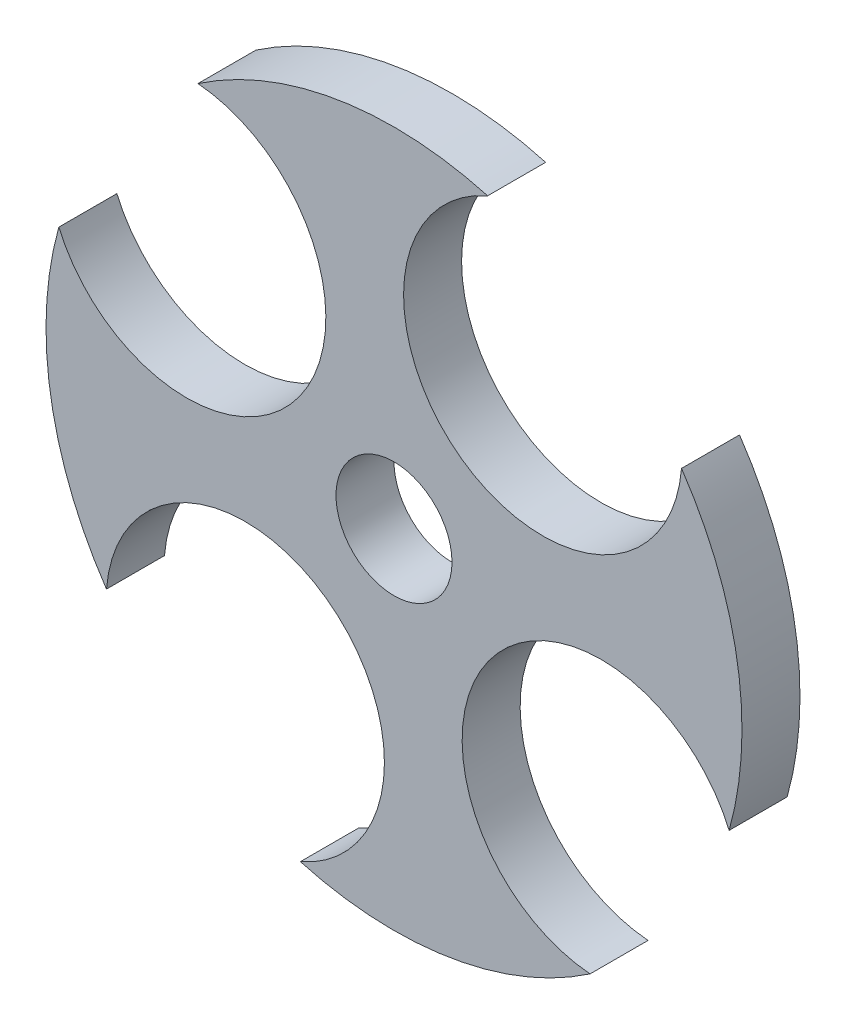
ISO-10303-21;
HEADER;
FILE_DESCRIPTION(('STEP AP214'),'2;1');
FILE_NAME('part.step','',(''),(''),'','','');
FILE_SCHEMA(('AUTOMOTIVE_DESIGN { 1 0 10303 214 1 1 1 1 }'));
ENDSEC;
DATA;
#1=APPLICATION_CONTEXT('core data for automotive mechanical design processes');
#2=APPLICATION_PROTOCOL_DEFINITION('international standard','automotive_design',2000,#1);
#3=PRODUCT_CONTEXT('',#1,'mechanical');
#4=PRODUCT('Part','Part','',(#3));
#5=PRODUCT_RELATED_PRODUCT_CATEGORY('part','',(#4));
#6=PRODUCT_DEFINITION_FORMATION('','',#4);
#7=PRODUCT_DEFINITION_CONTEXT('part definition',#1,'design');
#8=PRODUCT_DEFINITION('design','',#6,#7);
#9=PRODUCT_DEFINITION_SHAPE('','',#8);
#10=(LENGTH_UNIT() NAMED_UNIT(*) SI_UNIT(.MILLI.,.METRE.));
#11=(NAMED_UNIT(*) PLANE_ANGLE_UNIT() SI_UNIT($,.RADIAN.));
#12=(NAMED_UNIT(*) SI_UNIT($,.STERADIAN.) SOLID_ANGLE_UNIT());
#13=UNCERTAINTY_MEASURE_WITH_UNIT(LENGTH_MEASURE(1.E-05),#10,'distance_accuracy_value','');
#14=(GEOMETRIC_REPRESENTATION_CONTEXT(3) GLOBAL_UNCERTAINTY_ASSIGNED_CONTEXT((#13)) GLOBAL_UNIT_ASSIGNED_CONTEXT((#10,
#11,#12)) REPRESENTATION_CONTEXT('',''));
#15=CARTESIAN_POINT('',(0.,0.,0.));
#16=DIRECTION('',(0.,0.,1.));
#17=DIRECTION('',(1.,0.,0.));
#18=AXIS2_PLACEMENT_3D('',#15,#16,#17);
#19=CARTESIAN_POINT('',(-4.0723235353591,-5.67506881221368,3.175));
#20=DIRECTION('',(0.,0.,1.));
#21=DIRECTION('',(1.,0.,0.));
#22=AXIS2_PLACEMENT_3D('',#19,#20,#21);
#23=PLANE('',#22);
#24=CARTESIAN_POINT('',(-8.14464707071819,-11.3501376244274,3.175));
#25=DIRECTION('',(0.,0.,-1.));
#26=DIRECTION('',(1.,0.,0.));
#27=AXIS2_PLACEMENT_3D('',#24,#25,#26);
#28=CIRCLE('',#27,7.62);
#29=CARTESIAN_POINT('',(-15.7395127148097,-10.7317398170261,3.175));
#30=VERTEX_POINT('',#29);
#31=CARTESIAN_POINT('',(-5.12693845810469,-18.3471251711762,3.175));
#32=VERTEX_POINT('',#31);
#33=EDGE_CURVE('E164',#30,#32,#28,.T.);
#34=ORIENTED_EDGE('',*,*,#33,.T.);
#35=CARTESIAN_POINT('',(0.,0.,3.175));
#36=DIRECTION('',(0.,0.,1.));
#37=DIRECTION('',(1.,0.,0.));
#38=AXIS2_PLACEMENT_3D('',#35,#36,#37);
#39=CIRCLE('',#38,19.05);
#40=CARTESIAN_POINT('',(10.7317398170262,-15.7395127148097,3.175));
#41=VERTEX_POINT('',#40);
#42=EDGE_CURVE('E100',#32,#41,#39,.T.);
#43=ORIENTED_EDGE('',*,*,#42,.T.);
#44=CARTESIAN_POINT('',(11.3501376244274,-8.14464707071816,3.175));
#45=DIRECTION('',(0.,0.,-1.));
#46=DIRECTION('',(1.,0.,0.));
#47=AXIS2_PLACEMENT_3D('',#44,#45,#46);
#48=CIRCLE('',#47,7.62);
#49=CARTESIAN_POINT('',(18.3471251711762,-5.12693845810463,3.175));
#50=VERTEX_POINT('',#49);
#51=EDGE_CURVE('E185',#41,#50,#48,.T.);
#52=ORIENTED_EDGE('',*,*,#51,.T.);
#53=CARTESIAN_POINT('',(0.,0.,3.175));
#54=DIRECTION('',(0.,0.,1.));
#55=DIRECTION('',(1.,0.,0.));
#56=AXIS2_PLACEMENT_3D('',#53,#54,#55);
#57=CIRCLE('',#56,19.05);
#58=CARTESIAN_POINT('',(15.7395127148097,10.7317398170261,3.175));
#59=VERTEX_POINT('',#58);
#60=EDGE_CURVE('E199',#50,#59,#57,.T.);
#61=ORIENTED_EDGE('',*,*,#60,.T.);
#62=CARTESIAN_POINT('',(8.14464707071819,11.3501376244274,3.175));
#63=DIRECTION('',(0.,0.,-1.));
#64=DIRECTION('',(1.,0.,0.));
#65=AXIS2_PLACEMENT_3D('',#62,#63,#64);
#66=CIRCLE('',#65,7.62);
#67=CARTESIAN_POINT('',(5.12693845810469,18.3471251711762,3.175));
#68=VERTEX_POINT('',#67);
#69=EDGE_CURVE('E119',#59,#68,#66,.T.);
#70=ORIENTED_EDGE('',*,*,#69,.T.);
#71=CARTESIAN_POINT('',(0.,0.,3.175));
#72=DIRECTION('',(0.,0.,1.));
#73=DIRECTION('',(1.,0.,0.));
#74=AXIS2_PLACEMENT_3D('',#71,#72,#73);
#75=CIRCLE('',#74,19.05);
#76=CARTESIAN_POINT('',(-10.7317398170262,15.7395127148097,3.175));
#77=VERTEX_POINT('',#76);
#78=EDGE_CURVE('E113',#68,#77,#75,.T.);
#79=ORIENTED_EDGE('',*,*,#78,.T.);
#80=CARTESIAN_POINT('',(-11.3501376244274,8.14464707071815,3.175));
#81=DIRECTION('',(0.,0.,-1.));
#82=DIRECTION('',(1.,0.,0.));
#83=AXIS2_PLACEMENT_3D('',#80,#81,#82);
#84=CIRCLE('',#83,7.62);
#85=CARTESIAN_POINT('',(-18.3471251711762,5.12693845810463,3.175));
#86=VERTEX_POINT('',#85);
#87=EDGE_CURVE('E117',#77,#86,#84,.T.);
#88=ORIENTED_EDGE('',*,*,#87,.T.);
#89=CARTESIAN_POINT('',(0.,0.,3.175));
#90=DIRECTION('',(0.,0.,1.));
#91=DIRECTION('',(1.,0.,0.));
#92=AXIS2_PLACEMENT_3D('',#89,#90,#91);
#93=CIRCLE('',#92,19.05);
#94=EDGE_CURVE('E57',#86,#30,#93,.T.);
#95=ORIENTED_EDGE('',*,*,#94,.T.);
#96=EDGE_LOOP('',(#34,#43,#52,#61,#70,#79,#88,#95));
#97=FACE_BOUND('',#96,.T.);
#98=CARTESIAN_POINT('',(0.,0.,3.175));
#99=DIRECTION('',(0.,0.,1.));
#100=DIRECTION('',(1.,0.,0.));
#101=AXIS2_PLACEMENT_3D('',#98,#99,#100);
#102=CIRCLE('',#101,3.17499999999998);
#103=CARTESIAN_POINT('',(3.17499999999998,0.,3.175));
#104=VERTEX_POINT('',#103);
#105=EDGE_CURVE('E146',#104,#104,#102,.T.);
#106=ORIENTED_EDGE('',*,*,#105,.F.);
#107=EDGE_LOOP('',(#106));
#108=FACE_BOUND('',#107,.T.);
#109=ADVANCED_FACE('F39',(#97,#108),#23,.T.);
#110=CARTESIAN_POINT('',(-4.0723235353591,-5.67506881221368,0.));
#111=DIRECTION('',(0.,0.,1.));
#112=DIRECTION('',(1.,0.,0.));
#113=AXIS2_PLACEMENT_3D('',#110,#111,#112);
#114=PLANE('',#113);
#115=CARTESIAN_POINT('',(-8.14464707071819,-11.3501376244274,0.));
#116=DIRECTION('',(0.,0.,-1.));
#117=DIRECTION('',(1.,0.,0.));
#118=AXIS2_PLACEMENT_3D('',#115,#116,#117);
#119=CIRCLE('',#118,7.62);
#120=CARTESIAN_POINT('',(-15.7395127148097,-10.7317398170261,0.));
#121=VERTEX_POINT('',#120);
#122=CARTESIAN_POINT('',(-5.12693845810469,-18.3471251711762,0.));
#123=VERTEX_POINT('',#122);
#124=EDGE_CURVE('E141',#121,#123,#119,.T.);
#125=ORIENTED_EDGE('',*,*,#124,.F.);
#126=CARTESIAN_POINT('',(0.,0.,0.));
#127=DIRECTION('',(0.,0.,1.));
#128=DIRECTION('',(1.,0.,0.));
#129=AXIS2_PLACEMENT_3D('',#126,#127,#128);
#130=CIRCLE('',#129,19.05);
#131=CARTESIAN_POINT('',(-18.3471251711762,5.12693845810463,0.));
#132=VERTEX_POINT('',#131);
#133=EDGE_CURVE('E92',#132,#121,#130,.T.);
#134=ORIENTED_EDGE('',*,*,#133,.F.);
#135=CARTESIAN_POINT('',(-11.3501376244274,8.14464707071815,0.));
#136=DIRECTION('',(0.,0.,-1.));
#137=DIRECTION('',(1.,0.,0.));
#138=AXIS2_PLACEMENT_3D('',#135,#136,#137);
#139=CIRCLE('',#138,7.62);
#140=CARTESIAN_POINT('',(-10.7317398170262,15.7395127148097,0.));
#141=VERTEX_POINT('',#140);
#142=EDGE_CURVE('E86',#141,#132,#139,.T.);
#143=ORIENTED_EDGE('',*,*,#142,.F.);
#144=CARTESIAN_POINT('',(0.,0.,0.));
#145=DIRECTION('',(0.,0.,1.));
#146=DIRECTION('',(1.,0.,0.));
#147=AXIS2_PLACEMENT_3D('',#144,#145,#146);
#148=CIRCLE('',#147,19.05);
#149=CARTESIAN_POINT('',(5.12693845810469,18.3471251711762,0.));
#150=VERTEX_POINT('',#149);
#151=EDGE_CURVE('E128',#150,#141,#148,.T.);
#152=ORIENTED_EDGE('',*,*,#151,.F.);
#153=CARTESIAN_POINT('',(8.14464707071819,11.3501376244274,0.));
#154=DIRECTION('',(0.,0.,-1.));
#155=DIRECTION('',(1.,0.,0.));
#156=AXIS2_PLACEMENT_3D('',#153,#154,#155);
#157=CIRCLE('',#156,7.62);
#158=CARTESIAN_POINT('',(15.7395127148097,10.7317398170261,0.));
#159=VERTEX_POINT('',#158);
#160=EDGE_CURVE('E155',#159,#150,#157,.T.);
#161=ORIENTED_EDGE('',*,*,#160,.F.);
#162=CARTESIAN_POINT('',(0.,0.,0.));
#163=DIRECTION('',(0.,0.,1.));
#164=DIRECTION('',(1.,0.,0.));
#165=AXIS2_PLACEMENT_3D('',#162,#163,#164);
#166=CIRCLE('',#165,19.05);
#167=CARTESIAN_POINT('',(18.3471251711762,-5.12693845810463,0.));
#168=VERTEX_POINT('',#167);
#169=EDGE_CURVE('E152',#168,#159,#166,.T.);
#170=ORIENTED_EDGE('',*,*,#169,.F.);
#171=CARTESIAN_POINT('',(11.3501376244274,-8.14464707071816,0.));
#172=DIRECTION('',(0.,0.,-1.));
#173=DIRECTION('',(1.,0.,0.));
#174=AXIS2_PLACEMENT_3D('',#171,#172,#173);
#175=CIRCLE('',#174,7.62);
#176=CARTESIAN_POINT('',(10.7317398170262,-15.7395127148097,0.));
#177=VERTEX_POINT('',#176);
#178=EDGE_CURVE('E149',#177,#168,#175,.T.);
#179=ORIENTED_EDGE('',*,*,#178,.F.);
#180=CARTESIAN_POINT('',(0.,0.,0.));
#181=DIRECTION('',(0.,0.,1.));
#182=DIRECTION('',(1.,0.,0.));
#183=AXIS2_PLACEMENT_3D('',#180,#181,#182);
#184=CIRCLE('',#183,19.05);
#185=EDGE_CURVE('E145',#123,#177,#184,.T.);
#186=ORIENTED_EDGE('',*,*,#185,.F.);
#187=EDGE_LOOP('',(#125,#134,#143,#152,#161,#170,#179,#186));
#188=FACE_BOUND('',#187,.T.);
#189=CARTESIAN_POINT('',(0.,0.,0.));
#190=DIRECTION('',(0.,0.,1.));
#191=DIRECTION('',(1.,0.,0.));
#192=AXIS2_PLACEMENT_3D('',#189,#190,#191);
#193=CIRCLE('',#192,3.17499999999998);
#194=CARTESIAN_POINT('',(3.17499999999998,0.,0.));
#195=VERTEX_POINT('',#194);
#196=EDGE_CURVE('E209',#195,#195,#193,.T.);
#197=ORIENTED_EDGE('',*,*,#196,.T.);
#198=EDGE_LOOP('',(#197));
#199=FACE_BOUND('',#198,.T.);
#200=ADVANCED_FACE('F189',(#188,#199),#114,.F.);
#201=CARTESIAN_POINT('',(-8.14464707071819,-11.3501376244274,3.175));
#202=DIRECTION('',(0.,0.,-1.));
#203=DIRECTION('',(-1.,0.,0.));
#204=AXIS2_PLACEMENT_3D('',#201,#202,#203);
#205=CYLINDRICAL_SURFACE('',#204,7.62);
#206=ORIENTED_EDGE('',*,*,#124,.T.);
#207=DIRECTION('',(0.,0.,-1.));
#208=VECTOR('',#207,1.);
#209=CARTESIAN_POINT('',(-5.12693845810469,-18.3471251711762,3.175));
#210=LINE('',#209,#208);
#211=EDGE_CURVE('E11',#32,#123,#210,.T.);
#212=ORIENTED_EDGE('',*,*,#211,.F.);
#213=ORIENTED_EDGE('',*,*,#33,.F.);
#214=DIRECTION('',(0.,0.,-1.));
#215=VECTOR('',#214,1.);
#216=CARTESIAN_POINT('',(-15.7395127148097,-10.7317398170261,3.175));
#217=LINE('',#216,#215);
#218=EDGE_CURVE('E137',#30,#121,#217,.T.);
#219=ORIENTED_EDGE('',*,*,#218,.T.);
#220=EDGE_LOOP('',(#206,#212,#213,#219));
#221=FACE_BOUND('',#220,.T.);
#222=ADVANCED_FACE('F41',(#221),#205,.F.);
#223=CARTESIAN_POINT('',(0.,0.,3.175));
#224=DIRECTION('',(0.,0.,-1.));
#225=DIRECTION('',(-1.,0.,0.));
#226=AXIS2_PLACEMENT_3D('',#223,#224,#225);
#227=CYLINDRICAL_SURFACE('',#226,19.05);
#228=ORIENTED_EDGE('',*,*,#185,.T.);
#229=DIRECTION('',(0.,0.,-1.));
#230=VECTOR('',#229,1.);
#231=CARTESIAN_POINT('',(10.7317398170262,-15.7395127148097,3.175));
#232=LINE('',#231,#230);
#233=EDGE_CURVE('E49',#41,#177,#232,.T.);
#234=ORIENTED_EDGE('',*,*,#233,.F.);
#235=ORIENTED_EDGE('',*,*,#42,.F.);
#236=ORIENTED_EDGE('',*,*,#211,.T.);
#237=EDGE_LOOP('',(#228,#234,#235,#236));
#238=FACE_BOUND('',#237,.T.);
#239=ADVANCED_FACE('F239',(#238),#227,.T.);
#240=CARTESIAN_POINT('',(11.3501376244274,-8.14464707071816,3.175));
#241=DIRECTION('',(0.,0.,-1.));
#242=DIRECTION('',(-1.,0.,0.));
#243=AXIS2_PLACEMENT_3D('',#240,#241,#242);
#244=CYLINDRICAL_SURFACE('',#243,7.62);
#245=ORIENTED_EDGE('',*,*,#178,.T.);
#246=DIRECTION('',(0.,0.,-1.));
#247=VECTOR('',#246,1.);
#248=CARTESIAN_POINT('',(18.3471251711762,-5.12693845810463,3.175));
#249=LINE('',#248,#247);
#250=EDGE_CURVE('E175',#50,#168,#249,.T.);
#251=ORIENTED_EDGE('',*,*,#250,.F.);
#252=ORIENTED_EDGE('',*,*,#51,.F.);
#253=ORIENTED_EDGE('',*,*,#233,.T.);
#254=EDGE_LOOP('',(#245,#251,#252,#253));
#255=FACE_BOUND('',#254,.T.);
#256=ADVANCED_FACE('F183',(#255),#244,.F.);
#257=CARTESIAN_POINT('',(0.,0.,3.175));
#258=DIRECTION('',(0.,0.,-1.));
#259=DIRECTION('',(-1.,0.,0.));
#260=AXIS2_PLACEMENT_3D('',#257,#258,#259);
#261=CYLINDRICAL_SURFACE('',#260,19.05);
#262=ORIENTED_EDGE('',*,*,#169,.T.);
#263=DIRECTION('',(0.,0.,-1.));
#264=VECTOR('',#263,1.);
#265=CARTESIAN_POINT('',(15.7395127148097,10.7317398170261,3.175));
#266=LINE('',#265,#264);
#267=EDGE_CURVE('E171',#59,#159,#266,.T.);
#268=ORIENTED_EDGE('',*,*,#267,.F.);
#269=ORIENTED_EDGE('',*,*,#60,.F.);
#270=ORIENTED_EDGE('',*,*,#250,.T.);
#271=EDGE_LOOP('',(#262,#268,#269,#270));
#272=FACE_BOUND('',#271,.T.);
#273=ADVANCED_FACE('F194',(#272),#261,.T.);
#274=CARTESIAN_POINT('',(8.14464707071819,11.3501376244274,3.175));
#275=DIRECTION('',(0.,0.,-1.));
#276=DIRECTION('',(-1.,0.,0.));
#277=AXIS2_PLACEMENT_3D('',#274,#275,#276);
#278=CYLINDRICAL_SURFACE('',#277,7.62);
#279=ORIENTED_EDGE('',*,*,#160,.T.);
#280=DIRECTION('',(0.,0.,-1.));
#281=VECTOR('',#280,1.);
#282=CARTESIAN_POINT('',(5.12693845810469,18.3471251711762,3.175));
#283=LINE('',#282,#281);
#284=EDGE_CURVE('E130',#68,#150,#283,.T.);
#285=ORIENTED_EDGE('',*,*,#284,.F.);
#286=ORIENTED_EDGE('',*,*,#69,.F.);
#287=ORIENTED_EDGE('',*,*,#267,.T.);
#288=EDGE_LOOP('',(#279,#285,#286,#287));
#289=FACE_BOUND('',#288,.T.);
#290=ADVANCED_FACE('F197',(#289),#278,.F.);
#291=CARTESIAN_POINT('',(0.,0.,3.175));
#292=DIRECTION('',(0.,0.,-1.));
#293=DIRECTION('',(-1.,0.,0.));
#294=AXIS2_PLACEMENT_3D('',#291,#292,#293);
#295=CYLINDRICAL_SURFACE('',#294,19.05);
#296=ORIENTED_EDGE('',*,*,#151,.T.);
#297=DIRECTION('',(0.,0.,-1.));
#298=VECTOR('',#297,1.);
#299=CARTESIAN_POINT('',(-10.7317398170262,15.7395127148097,3.175));
#300=LINE('',#299,#298);
#301=EDGE_CURVE('E125',#77,#141,#300,.T.);
#302=ORIENTED_EDGE('',*,*,#301,.F.);
#303=ORIENTED_EDGE('',*,*,#78,.F.);
#304=ORIENTED_EDGE('',*,*,#284,.T.);
#305=EDGE_LOOP('',(#296,#302,#303,#304));
#306=FACE_BOUND('',#305,.T.);
#307=ADVANCED_FACE('F126',(#306),#295,.T.);
#308=CARTESIAN_POINT('',(-11.3501376244274,8.14464707071815,3.175));
#309=DIRECTION('',(0.,0.,-1.));
#310=DIRECTION('',(-1.,0.,0.));
#311=AXIS2_PLACEMENT_3D('',#308,#309,#310);
#312=CYLINDRICAL_SURFACE('',#311,7.62);
#313=ORIENTED_EDGE('',*,*,#142,.T.);
#314=DIRECTION('',(0.,0.,-1.));
#315=VECTOR('',#314,1.);
#316=CARTESIAN_POINT('',(-18.3471251711762,5.12693845810463,3.175));
#317=LINE('',#316,#315);
#318=EDGE_CURVE('E131',#86,#132,#317,.T.);
#319=ORIENTED_EDGE('',*,*,#318,.F.);
#320=ORIENTED_EDGE('',*,*,#87,.F.);
#321=ORIENTED_EDGE('',*,*,#301,.T.);
#322=EDGE_LOOP('',(#313,#319,#320,#321));
#323=FACE_BOUND('',#322,.T.);
#324=ADVANCED_FACE('F133',(#323),#312,.F.);
#325=CARTESIAN_POINT('',(0.,0.,3.175));
#326=DIRECTION('',(0.,0.,-1.));
#327=DIRECTION('',(-1.,0.,0.));
#328=AXIS2_PLACEMENT_3D('',#325,#326,#327);
#329=CYLINDRICAL_SURFACE('',#328,19.05);
#330=ORIENTED_EDGE('',*,*,#133,.T.);
#331=ORIENTED_EDGE('',*,*,#218,.F.);
#332=ORIENTED_EDGE('',*,*,#94,.F.);
#333=ORIENTED_EDGE('',*,*,#318,.T.);
#334=EDGE_LOOP('',(#330,#331,#332,#333));
#335=FACE_BOUND('',#334,.T.);
#336=ADVANCED_FACE('F227',(#335),#329,.T.);
#337=CARTESIAN_POINT('',(0.,0.,3.175));
#338=DIRECTION('',(0.,0.,-1.));
#339=DIRECTION('',(-1.,0.,0.));
#340=AXIS2_PLACEMENT_3D('',#337,#338,#339);
#341=CYLINDRICAL_SURFACE('',#340,3.17499999999998);
#342=ORIENTED_EDGE('',*,*,#105,.T.);
#343=EDGE_LOOP('',(#342));
#344=FACE_BOUND('',#343,.T.);
#345=ORIENTED_EDGE('',*,*,#196,.F.);
#346=EDGE_LOOP('',(#345));
#347=FACE_BOUND('',#346,.T.);
#348=ADVANCED_FACE('F217',(#344,#347),#341,.F.);
#349=CLOSED_SHELL('',(#109,#200,#222,#239,#256,#273,#290,#307,#324,#336,#348));
#350=MANIFOLD_SOLID_BREP('B2',#349);
#351=ADVANCED_BREP_SHAPE_REPRESENTATION('',(#18,#350),#14);
#352=SHAPE_DEFINITION_REPRESENTATION(#9,#351);
ENDSEC;
END-ISO-10303-21;
